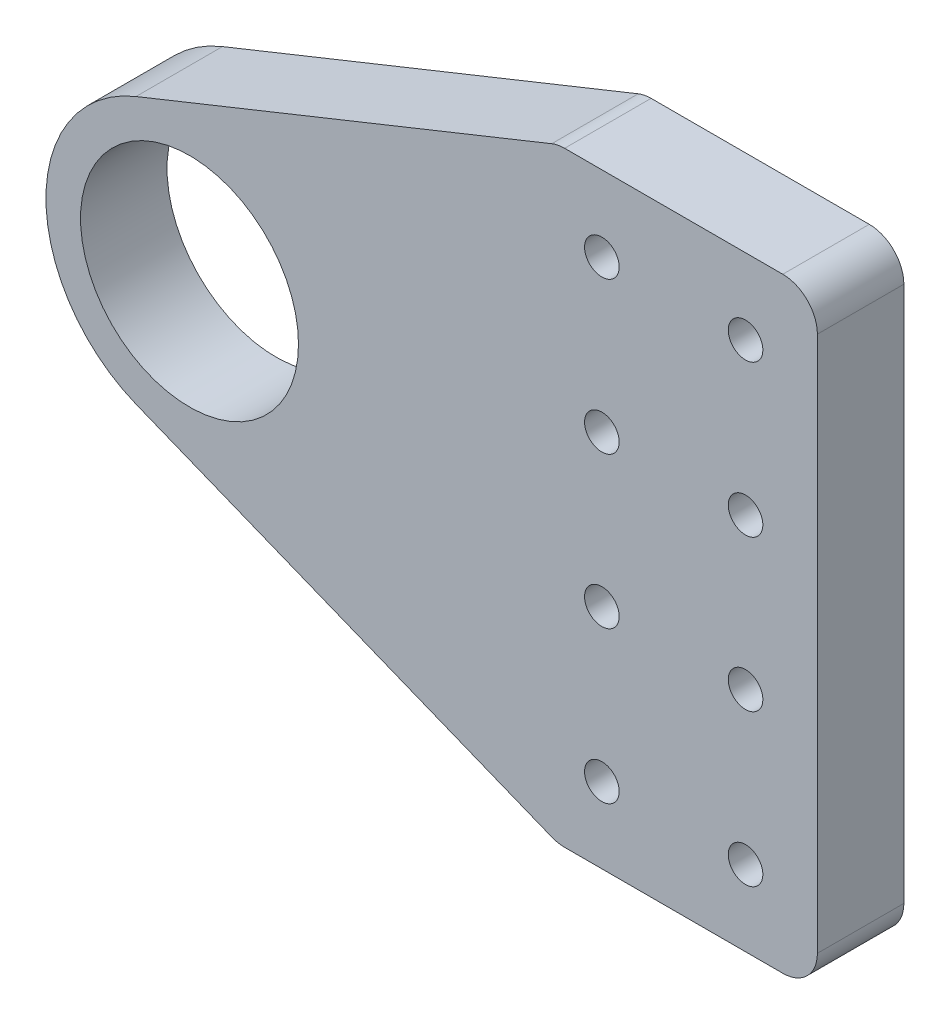
ISO-10303-21;
HEADER;
FILE_DESCRIPTION(('STEP AP214'),'2;1');
FILE_NAME('part.step','',(''),(''),'','','');
FILE_SCHEMA(('AUTOMOTIVE_DESIGN { 1 0 10303 214 1 1 1 1 }'));
ENDSEC;
DATA;
#1=APPLICATION_CONTEXT('core data for automotive mechanical design processes');
#2=APPLICATION_PROTOCOL_DEFINITION('international standard','automotive_design',2000,#1);
#3=PRODUCT_CONTEXT('',#1,'mechanical');
#4=PRODUCT('Part','Part','',(#3));
#5=PRODUCT_RELATED_PRODUCT_CATEGORY('part','',(#4));
#6=PRODUCT_DEFINITION_FORMATION('','',#4);
#7=PRODUCT_DEFINITION_CONTEXT('part definition',#1,'design');
#8=PRODUCT_DEFINITION('design','',#6,#7);
#9=PRODUCT_DEFINITION_SHAPE('','',#8);
#10=(LENGTH_UNIT() NAMED_UNIT(*) SI_UNIT(.MILLI.,.METRE.));
#11=(NAMED_UNIT(*) PLANE_ANGLE_UNIT() SI_UNIT($,.RADIAN.));
#12=(NAMED_UNIT(*) SI_UNIT($,.STERADIAN.) SOLID_ANGLE_UNIT());
#13=UNCERTAINTY_MEASURE_WITH_UNIT(LENGTH_MEASURE(1.E-05),#10,'distance_accuracy_value','');
#14=(GEOMETRIC_REPRESENTATION_CONTEXT(3) GLOBAL_UNCERTAINTY_ASSIGNED_CONTEXT((#13)) GLOBAL_UNIT_ASSIGNED_CONTEXT((#10,
#11,#12)) REPRESENTATION_CONTEXT('',''));
#15=CARTESIAN_POINT('',(0.,0.,0.));
#16=DIRECTION('',(0.,0.,1.));
#17=DIRECTION('',(1.,0.,0.));
#18=AXIS2_PLACEMENT_3D('',#15,#16,#17);
#19=CARTESIAN_POINT('',(822.198,-247.65,12.7));
#20=DIRECTION('',(0.,0.,1.));
#21=DIRECTION('',(1.,0.,0.));
#22=AXIS2_PLACEMENT_3D('',#19,#20,#21);
#23=PLANE('',#22);
#24=CARTESIAN_POINT('',(903.850524959397,-258.748026915631,12.7));
#25=DIRECTION('',(0.,0.,1.));
#26=DIRECTION('',(1.,0.,0.));
#27=AXIS2_PLACEMENT_3D('',#24,#25,#26);
#28=CIRCLE('',#27,2.53999999999996);
#29=CARTESIAN_POINT('',(906.390524959397,-258.748026915631,12.7));
#30=VERTEX_POINT('',#29);
#31=EDGE_CURVE('E248',#30,#30,#28,.T.);
#32=ORIENTED_EDGE('',*,*,#31,.F.);
#33=EDGE_LOOP('',(#32));
#34=FACE_BOUND('',#33,.T.);
#35=CARTESIAN_POINT('',(882.75157487819,-258.748026915631,12.7));
#36=DIRECTION('',(0.,0.,1.));
#37=DIRECTION('',(-1.,0.,0.));
#38=AXIS2_PLACEMENT_3D('',#35,#36,#37);
#39=CIRCLE('',#38,2.53999999999996);
#40=CARTESIAN_POINT('',(880.21157487819,-258.748026915631,12.7));
#41=VERTEX_POINT('',#40);
#42=EDGE_CURVE('E236',#41,#41,#39,.T.);
#43=ORIENTED_EDGE('',*,*,#42,.F.);
#44=EDGE_LOOP('',(#43));
#45=FACE_BOUND('',#44,.T.);
#46=CARTESIAN_POINT('',(882.75157487819,-236.551973084369,12.7));
#47=DIRECTION('',(0.,0.,1.));
#48=DIRECTION('',(1.,0.,0.));
#49=AXIS2_PLACEMENT_3D('',#46,#47,#48);
#50=CIRCLE('',#49,2.53999999999996);
#51=CARTESIAN_POINT('',(885.29157487819,-236.551973084369,12.7));
#52=VERTEX_POINT('',#51);
#53=EDGE_CURVE('E224',#52,#52,#50,.T.);
#54=ORIENTED_EDGE('',*,*,#53,.F.);
#55=EDGE_LOOP('',(#54));
#56=FACE_BOUND('',#55,.T.);
#57=CARTESIAN_POINT('',(822.198,-247.65,12.7));
#58=DIRECTION('',(0.,0.,1.));
#59=DIRECTION('',(1.,0.,0.));
#60=AXIS2_PLACEMENT_3D('',#57,#58,#59);
#61=CIRCLE('',#60,16.0019999999999);
#62=CARTESIAN_POINT('',(838.2,-247.65,12.7));
#63=VERTEX_POINT('',#62);
#64=EDGE_CURVE('E212',#63,#63,#61,.T.);
#65=ORIENTED_EDGE('',*,*,#64,.F.);
#66=EDGE_LOOP('',(#65));
#67=FACE_BOUND('',#66,.T.);
#68=CARTESIAN_POINT('',(822.198,-247.65,12.7));
#69=DIRECTION('',(0.,0.,1.));
#70=DIRECTION('',(1.,0.,0.));
#71=AXIS2_PLACEMENT_3D('',#68,#69,#70);
#72=CIRCLE('',#71,21.0820000000001);
#73=CARTESIAN_POINT('',(814.3402563121,-228.087111968442,12.7));
#74=VERTEX_POINT('',#73);
#75=CARTESIAN_POINT('',(814.3402563121,-267.212888031558,12.7));
#76=VERTEX_POINT('',#75);
#77=EDGE_CURVE('E161',#74,#76,#72,.T.);
#78=ORIENTED_EDGE('',*,*,#77,.T.);
#79=DIRECTION('',(0.927942701430507,-0.372722876762151,0.));
#80=VECTOR('',#79,1.);
#81=CARTESIAN_POINT('',(875.388667623635,-291.733948923267,12.7));
#82=LINE('',#81,#80);
#83=CARTESIAN_POINT('',(875.388667623635,-291.733948923267,12.7));
#84=VERTEX_POINT('',#83);
#85=EDGE_CURVE('E99',#76,#84,#82,.T.);
#86=ORIENTED_EDGE('',*,*,#85,.T.);
#87=CARTESIAN_POINT('',(877.282099837587,-287.02,12.7));
#88=DIRECTION('',(0.,0.,1.));
#89=DIRECTION('',(-1.,0.,0.));
#90=AXIS2_PLACEMENT_3D('',#87,#88,#89);
#91=CIRCLE('',#90,5.07999999999995);
#92=CARTESIAN_POINT('',(877.282099837587,-292.1,12.7));
#93=VERTEX_POINT('',#92);
#94=EDGE_CURVE('E182',#84,#93,#91,.T.);
#95=ORIENTED_EDGE('',*,*,#94,.T.);
#96=DIRECTION('',(1.,0.,0.));
#97=VECTOR('',#96,1.);
#98=CARTESIAN_POINT('',(877.282099837587,-292.1,12.7));
#99=LINE('',#98,#97);
#100=CARTESIAN_POINT('',(909.32,-292.1,12.7));
#101=VERTEX_POINT('',#100);
#102=EDGE_CURVE('E201',#93,#101,#99,.T.);
#103=ORIENTED_EDGE('',*,*,#102,.T.);
#104=CARTESIAN_POINT('',(909.32,-287.02,12.7));
#105=DIRECTION('',(0.,0.,1.));
#106=DIRECTION('',(1.,0.,0.));
#107=AXIS2_PLACEMENT_3D('',#104,#105,#106);
#108=CIRCLE('',#107,5.07999999999997);
#109=CARTESIAN_POINT('',(914.4,-287.02,12.7));
#110=VERTEX_POINT('',#109);
#111=EDGE_CURVE('E198',#101,#110,#108,.T.);
#112=ORIENTED_EDGE('',*,*,#111,.T.);
#113=DIRECTION('',(0.,1.,0.));
#114=VECTOR('',#113,1.);
#115=CARTESIAN_POINT('',(914.4,-287.02,12.7));
#116=LINE('',#115,#114);
#117=CARTESIAN_POINT('',(914.4,-208.28,12.7));
#118=VERTEX_POINT('',#117);
#119=EDGE_CURVE('E200',#110,#118,#116,.T.);
#120=ORIENTED_EDGE('',*,*,#119,.T.);
#121=CARTESIAN_POINT('',(909.32,-208.28,12.7));
#122=DIRECTION('',(0.,0.,1.));
#123=DIRECTION('',(-1.,0.,0.));
#124=AXIS2_PLACEMENT_3D('',#121,#122,#123);
#125=CIRCLE('',#124,5.07999999999999);
#126=CARTESIAN_POINT('',(909.32,-203.2,12.7));
#127=VERTEX_POINT('',#126);
#128=EDGE_CURVE('E124',#118,#127,#125,.T.);
#129=ORIENTED_EDGE('',*,*,#128,.T.);
#130=DIRECTION('',(-1.,0.,0.));
#131=VECTOR('',#130,1.);
#132=CARTESIAN_POINT('',(877.282099837587,-203.2,12.7));
#133=LINE('',#132,#131);
#134=CARTESIAN_POINT('',(877.282099837587,-203.2,12.7));
#135=VERTEX_POINT('',#134);
#136=EDGE_CURVE('E118',#127,#135,#133,.T.);
#137=ORIENTED_EDGE('',*,*,#136,.T.);
#138=CARTESIAN_POINT('',(877.282099837587,-208.28,12.7));
#139=DIRECTION('',(0.,0.,1.));
#140=DIRECTION('',(1.,0.,0.));
#141=AXIS2_PLACEMENT_3D('',#138,#139,#140);
#142=CIRCLE('',#141,5.08);
#143=CARTESIAN_POINT('',(875.388667623635,-203.566051076733,12.7));
#144=VERTEX_POINT('',#143);
#145=EDGE_CURVE('E122',#135,#144,#142,.T.);
#146=ORIENTED_EDGE('',*,*,#145,.T.);
#147=DIRECTION('',(-0.927942701430507,-0.372722876762151,0.));
#148=VECTOR('',#147,1.);
#149=CARTESIAN_POINT('',(875.388667623635,-203.566051076733,12.7));
#150=LINE('',#149,#148);
#151=EDGE_CURVE('E50',#144,#74,#150,.T.);
#152=ORIENTED_EDGE('',*,*,#151,.T.);
#153=EDGE_LOOP('',(#78,#86,#95,#103,#112,#120,#129,#137,#146,#152));
#154=FACE_BOUND('',#153,.T.);
#155=CARTESIAN_POINT('',(903.850524959397,-214.298026915631,12.7));
#156=DIRECTION('',(0.,0.,1.));
#157=DIRECTION('',(1.,0.,0.));
#158=AXIS2_PLACEMENT_3D('',#155,#156,#157);
#159=CIRCLE('',#158,2.53999999999996);
#160=CARTESIAN_POINT('',(906.390524959397,-214.298026915631,12.7));
#161=VERTEX_POINT('',#160);
#162=EDGE_CURVE('E146',#161,#161,#159,.T.);
#163=ORIENTED_EDGE('',*,*,#162,.F.);
#164=EDGE_LOOP('',(#163));
#165=FACE_BOUND('',#164,.T.);
#166=CARTESIAN_POINT('',(882.75157487819,-214.298026915631,12.7));
#167=DIRECTION('',(0.,0.,1.));
#168=DIRECTION('',(-1.,0.,0.));
#169=AXIS2_PLACEMENT_3D('',#166,#167,#168);
#170=CIRCLE('',#169,2.53999999999996);
#171=CARTESIAN_POINT('',(880.21157487819,-214.298026915631,12.7));
#172=VERTEX_POINT('',#171);
#173=EDGE_CURVE('E218',#172,#172,#170,.T.);
#174=ORIENTED_EDGE('',*,*,#173,.F.);
#175=EDGE_LOOP('',(#174));
#176=FACE_BOUND('',#175,.T.);
#177=CARTESIAN_POINT('',(903.850524959397,-236.551973084369,12.7));
#178=DIRECTION('',(0.,0.,1.));
#179=DIRECTION('',(-1.,0.,0.));
#180=AXIS2_PLACEMENT_3D('',#177,#178,#179);
#181=CIRCLE('',#180,2.53999999999996);
#182=CARTESIAN_POINT('',(901.310524959397,-236.551973084369,12.7));
#183=VERTEX_POINT('',#182);
#184=EDGE_CURVE('E230',#183,#183,#181,.T.);
#185=ORIENTED_EDGE('',*,*,#184,.F.);
#186=EDGE_LOOP('',(#185));
#187=FACE_BOUND('',#186,.T.);
#188=CARTESIAN_POINT('',(882.75157487819,-281.001973084369,12.7));
#189=DIRECTION('',(0.,0.,1.));
#190=DIRECTION('',(1.,0.,0.));
#191=AXIS2_PLACEMENT_3D('',#188,#189,#190);
#192=CIRCLE('',#191,2.53999999999996);
#193=CARTESIAN_POINT('',(885.29157487819,-281.001973084369,12.7));
#194=VERTEX_POINT('',#193);
#195=EDGE_CURVE('E242',#194,#194,#192,.T.);
#196=ORIENTED_EDGE('',*,*,#195,.F.);
#197=EDGE_LOOP('',(#196));
#198=FACE_BOUND('',#197,.T.);
#199=CARTESIAN_POINT('',(903.850524959397,-281.001973084369,12.7));
#200=DIRECTION('',(0.,0.,1.));
#201=DIRECTION('',(-1.,0.,0.));
#202=AXIS2_PLACEMENT_3D('',#199,#200,#201);
#203=CIRCLE('',#202,2.53999999999996);
#204=CARTESIAN_POINT('',(901.310524959397,-281.001973084369,12.7));
#205=VERTEX_POINT('',#204);
#206=EDGE_CURVE('E254',#205,#205,#203,.T.);
#207=ORIENTED_EDGE('',*,*,#206,.F.);
#208=EDGE_LOOP('',(#207));
#209=FACE_BOUND('',#208,.T.);
#210=ADVANCED_FACE('F33',(#34,#45,#56,#67,#154,#165,#176,#187,#198,#209),#23,.T.);
#211=CARTESIAN_POINT('',(822.198,-247.65,0.));
#212=DIRECTION('',(0.,0.,1.));
#213=DIRECTION('',(1.,0.,0.));
#214=AXIS2_PLACEMENT_3D('',#211,#212,#213);
#215=PLANE('',#214);
#216=CARTESIAN_POINT('',(822.198,-247.65,0.));
#217=DIRECTION('',(0.,0.,1.));
#218=DIRECTION('',(1.,0.,0.));
#219=AXIS2_PLACEMENT_3D('',#216,#217,#218);
#220=CIRCLE('',#219,21.0820000000001);
#221=CARTESIAN_POINT('',(814.3402563121,-228.087111968442,0.));
#222=VERTEX_POINT('',#221);
#223=CARTESIAN_POINT('',(814.3402563121,-267.212888031558,0.));
#224=VERTEX_POINT('',#223);
#225=EDGE_CURVE('E142',#222,#224,#220,.T.);
#226=ORIENTED_EDGE('',*,*,#225,.F.);
#227=DIRECTION('',(-0.927942701430507,-0.372722876762151,0.));
#228=VECTOR('',#227,1.);
#229=CARTESIAN_POINT('',(875.388667623635,-203.566051076733,0.));
#230=LINE('',#229,#228);
#231=CARTESIAN_POINT('',(875.388667623635,-203.566051076733,0.));
#232=VERTEX_POINT('',#231);
#233=EDGE_CURVE('E91',#232,#222,#230,.T.);
#234=ORIENTED_EDGE('',*,*,#233,.F.);
#235=CARTESIAN_POINT('',(877.282099837587,-208.28,0.));
#236=DIRECTION('',(0.,0.,1.));
#237=DIRECTION('',(1.,0.,0.));
#238=AXIS2_PLACEMENT_3D('',#235,#236,#237);
#239=CIRCLE('',#238,5.08);
#240=CARTESIAN_POINT('',(877.282099837587,-203.2,0.));
#241=VERTEX_POINT('',#240);
#242=EDGE_CURVE('E85',#241,#232,#239,.T.);
#243=ORIENTED_EDGE('',*,*,#242,.F.);
#244=DIRECTION('',(-1.,0.,0.));
#245=VECTOR('',#244,1.);
#246=CARTESIAN_POINT('',(877.282099837587,-203.2,0.));
#247=LINE('',#246,#245);
#248=CARTESIAN_POINT('',(909.32,-203.2,0.));
#249=VERTEX_POINT('',#248);
#250=EDGE_CURVE('E132',#249,#241,#247,.T.);
#251=ORIENTED_EDGE('',*,*,#250,.F.);
#252=CARTESIAN_POINT('',(909.32,-208.28,0.));
#253=DIRECTION('',(0.,0.,1.));
#254=DIRECTION('',(-1.,0.,0.));
#255=AXIS2_PLACEMENT_3D('',#252,#253,#254);
#256=CIRCLE('',#255,5.07999999999999);
#257=CARTESIAN_POINT('',(914.4,-208.28,0.));
#258=VERTEX_POINT('',#257);
#259=EDGE_CURVE('E156',#258,#249,#256,.T.);
#260=ORIENTED_EDGE('',*,*,#259,.F.);
#261=DIRECTION('',(0.,1.,0.));
#262=VECTOR('',#261,1.);
#263=CARTESIAN_POINT('',(914.4,-287.02,0.));
#264=LINE('',#263,#262);
#265=CARTESIAN_POINT('',(914.4,-287.02,0.));
#266=VERTEX_POINT('',#265);
#267=EDGE_CURVE('E154',#266,#258,#264,.T.);
#268=ORIENTED_EDGE('',*,*,#267,.F.);
#269=CARTESIAN_POINT('',(909.32,-287.02,0.));
#270=DIRECTION('',(0.,0.,1.));
#271=DIRECTION('',(1.,0.,0.));
#272=AXIS2_PLACEMENT_3D('',#269,#270,#271);
#273=CIRCLE('',#272,5.07999999999997);
#274=CARTESIAN_POINT('',(909.32,-292.1,0.));
#275=VERTEX_POINT('',#274);
#276=EDGE_CURVE('E152',#275,#266,#273,.T.);
#277=ORIENTED_EDGE('',*,*,#276,.F.);
#278=DIRECTION('',(1.,0.,0.));
#279=VECTOR('',#278,1.);
#280=CARTESIAN_POINT('',(877.282099837587,-292.1,0.));
#281=LINE('',#280,#279);
#282=CARTESIAN_POINT('',(877.282099837587,-292.1,0.));
#283=VERTEX_POINT('',#282);
#284=EDGE_CURVE('E150',#283,#275,#281,.T.);
#285=ORIENTED_EDGE('',*,*,#284,.F.);
#286=CARTESIAN_POINT('',(877.282099837587,-287.02,0.));
#287=DIRECTION('',(0.,0.,1.));
#288=DIRECTION('',(-1.,0.,0.));
#289=AXIS2_PLACEMENT_3D('',#286,#287,#288);
#290=CIRCLE('',#289,5.07999999999995);
#291=CARTESIAN_POINT('',(875.388667623635,-291.733948923267,0.));
#292=VERTEX_POINT('',#291);
#293=EDGE_CURVE('E148',#292,#283,#290,.T.);
#294=ORIENTED_EDGE('',*,*,#293,.F.);
#295=DIRECTION('',(0.927942701430507,-0.372722876762151,0.));
#296=VECTOR('',#295,1.);
#297=CARTESIAN_POINT('',(875.388667623635,-291.733948923267,0.));
#298=LINE('',#297,#296);
#299=EDGE_CURVE('E145',#224,#292,#298,.T.);
#300=ORIENTED_EDGE('',*,*,#299,.F.);
#301=EDGE_LOOP('',(#226,#234,#243,#251,#260,#268,#277,#285,#294,#300));
#302=FACE_BOUND('',#301,.T.);
#303=CARTESIAN_POINT('',(903.850524959397,-214.298026915631,0.));
#304=DIRECTION('',(0.,0.,1.));
#305=DIRECTION('',(1.,0.,0.));
#306=AXIS2_PLACEMENT_3D('',#303,#304,#305);
#307=CIRCLE('',#306,2.53999999999996);
#308=CARTESIAN_POINT('',(906.390524959397,-214.298026915631,0.));
#309=VERTEX_POINT('',#308);
#310=EDGE_CURVE('E209',#309,#309,#307,.T.);
#311=ORIENTED_EDGE('',*,*,#310,.T.);
#312=EDGE_LOOP('',(#311));
#313=FACE_BOUND('',#312,.T.);
#314=CARTESIAN_POINT('',(822.198,-247.65,0.));
#315=DIRECTION('',(0.,0.,1.));
#316=DIRECTION('',(1.,0.,0.));
#317=AXIS2_PLACEMENT_3D('',#314,#315,#316);
#318=CIRCLE('',#317,16.0019999999999);
#319=CARTESIAN_POINT('',(838.2,-247.65,0.));
#320=VERTEX_POINT('',#319);
#321=EDGE_CURVE('E215',#320,#320,#318,.T.);
#322=ORIENTED_EDGE('',*,*,#321,.T.);
#323=EDGE_LOOP('',(#322));
#324=FACE_BOUND('',#323,.T.);
#325=CARTESIAN_POINT('',(882.75157487819,-214.298026915631,0.));
#326=DIRECTION('',(0.,0.,1.));
#327=DIRECTION('',(-1.,0.,0.));
#328=AXIS2_PLACEMENT_3D('',#325,#326,#327);
#329=CIRCLE('',#328,2.53999999999996);
#330=CARTESIAN_POINT('',(880.21157487819,-214.298026915631,0.));
#331=VERTEX_POINT('',#330);
#332=EDGE_CURVE('E221',#331,#331,#329,.T.);
#333=ORIENTED_EDGE('',*,*,#332,.T.);
#334=EDGE_LOOP('',(#333));
#335=FACE_BOUND('',#334,.T.);
#336=CARTESIAN_POINT('',(882.75157487819,-236.551973084369,0.));
#337=DIRECTION('',(0.,0.,1.));
#338=DIRECTION('',(1.,0.,0.));
#339=AXIS2_PLACEMENT_3D('',#336,#337,#338);
#340=CIRCLE('',#339,2.53999999999996);
#341=CARTESIAN_POINT('',(885.29157487819,-236.551973084369,0.));
#342=VERTEX_POINT('',#341);
#343=EDGE_CURVE('E227',#342,#342,#340,.T.);
#344=ORIENTED_EDGE('',*,*,#343,.T.);
#345=EDGE_LOOP('',(#344));
#346=FACE_BOUND('',#345,.T.);
#347=CARTESIAN_POINT('',(903.850524959397,-236.551973084369,0.));
#348=DIRECTION('',(0.,0.,1.));
#349=DIRECTION('',(-1.,0.,0.));
#350=AXIS2_PLACEMENT_3D('',#347,#348,#349);
#351=CIRCLE('',#350,2.53999999999996);
#352=CARTESIAN_POINT('',(901.310524959397,-236.551973084369,0.));
#353=VERTEX_POINT('',#352);
#354=EDGE_CURVE('E233',#353,#353,#351,.T.);
#355=ORIENTED_EDGE('',*,*,#354,.T.);
#356=EDGE_LOOP('',(#355));
#357=FACE_BOUND('',#356,.T.);
#358=CARTESIAN_POINT('',(882.75157487819,-258.748026915631,0.));
#359=DIRECTION('',(0.,0.,1.));
#360=DIRECTION('',(-1.,0.,0.));
#361=AXIS2_PLACEMENT_3D('',#358,#359,#360);
#362=CIRCLE('',#361,2.53999999999996);
#363=CARTESIAN_POINT('',(880.21157487819,-258.748026915631,0.));
#364=VERTEX_POINT('',#363);
#365=EDGE_CURVE('E239',#364,#364,#362,.T.);
#366=ORIENTED_EDGE('',*,*,#365,.T.);
#367=EDGE_LOOP('',(#366));
#368=FACE_BOUND('',#367,.T.);
#369=CARTESIAN_POINT('',(882.75157487819,-281.001973084369,0.));
#370=DIRECTION('',(0.,0.,1.));
#371=DIRECTION('',(1.,0.,0.));
#372=AXIS2_PLACEMENT_3D('',#369,#370,#371);
#373=CIRCLE('',#372,2.53999999999996);
#374=CARTESIAN_POINT('',(885.29157487819,-281.001973084369,0.));
#375=VERTEX_POINT('',#374);
#376=EDGE_CURVE('E245',#375,#375,#373,.T.);
#377=ORIENTED_EDGE('',*,*,#376,.T.);
#378=EDGE_LOOP('',(#377));
#379=FACE_BOUND('',#378,.T.);
#380=CARTESIAN_POINT('',(903.850524959397,-258.748026915631,0.));
#381=DIRECTION('',(0.,0.,1.));
#382=DIRECTION('',(1.,0.,0.));
#383=AXIS2_PLACEMENT_3D('',#380,#381,#382);
#384=CIRCLE('',#383,2.53999999999996);
#385=CARTESIAN_POINT('',(906.390524959397,-258.748026915631,0.));
#386=VERTEX_POINT('',#385);
#387=EDGE_CURVE('E251',#386,#386,#384,.T.);
#388=ORIENTED_EDGE('',*,*,#387,.T.);
#389=EDGE_LOOP('',(#388));
#390=FACE_BOUND('',#389,.T.);
#391=CARTESIAN_POINT('',(903.850524959397,-281.001973084369,0.));
#392=DIRECTION('',(0.,0.,1.));
#393=DIRECTION('',(-1.,0.,0.));
#394=AXIS2_PLACEMENT_3D('',#391,#392,#393);
#395=CIRCLE('',#394,2.53999999999996);
#396=CARTESIAN_POINT('',(901.310524959397,-281.001973084369,0.));
#397=VERTEX_POINT('',#396);
#398=EDGE_CURVE('E257',#397,#397,#395,.T.);
#399=ORIENTED_EDGE('',*,*,#398,.T.);
#400=EDGE_LOOP('',(#399));
#401=FACE_BOUND('',#400,.T.);
#402=ADVANCED_FACE('F186',(#302,#313,#324,#335,#346,#357,#368,#379,#390,#401),#215,.F.);
#403=CARTESIAN_POINT('',(822.198,-247.65,12.7));
#404=DIRECTION('',(0.,0.,-1.));
#405=DIRECTION('',(-1.,0.,0.));
#406=AXIS2_PLACEMENT_3D('',#403,#404,#405);
#407=CYLINDRICAL_SURFACE('',#406,21.0820000000001);
#408=ORIENTED_EDGE('',*,*,#225,.T.);
#409=DIRECTION('',(0.,0.,-1.));
#410=VECTOR('',#409,1.);
#411=CARTESIAN_POINT('',(814.3402563121,-267.212888031558,12.7));
#412=LINE('',#411,#410);
#413=EDGE_CURVE('E11',#76,#224,#412,.T.);
#414=ORIENTED_EDGE('',*,*,#413,.F.);
#415=ORIENTED_EDGE('',*,*,#77,.F.);
#416=DIRECTION('',(0.,0.,-1.));
#417=VECTOR('',#416,1.);
#418=CARTESIAN_POINT('',(814.3402563121,-228.087111968442,12.7));
#419=LINE('',#418,#417);
#420=EDGE_CURVE('E138',#74,#222,#419,.T.);
#421=ORIENTED_EDGE('',*,*,#420,.T.);
#422=EDGE_LOOP('',(#408,#414,#415,#421));
#423=FACE_BOUND('',#422,.T.);
#424=ADVANCED_FACE('F35',(#423),#407,.T.);
#425=CARTESIAN_POINT('',(875.388667623635,-291.733948923267,12.7));
#426=DIRECTION('',(0.372722876762151,0.927942701430507,0.));
#427=DIRECTION('',(-0.927942701430507,0.372722876762151,0.));
#428=AXIS2_PLACEMENT_3D('',#425,#426,#427);
#429=PLANE('',#428);
#430=ORIENTED_EDGE('',*,*,#299,.T.);
#431=DIRECTION('',(0.,0.,-1.));
#432=VECTOR('',#431,1.);
#433=CARTESIAN_POINT('',(875.388667623635,-291.733948923267,12.7));
#434=LINE('',#433,#432);
#435=EDGE_CURVE('E42',#84,#292,#434,.T.);
#436=ORIENTED_EDGE('',*,*,#435,.F.);
#437=ORIENTED_EDGE('',*,*,#85,.F.);
#438=ORIENTED_EDGE('',*,*,#413,.T.);
#439=EDGE_LOOP('',(#430,#436,#437,#438));
#440=FACE_BOUND('',#439,.T.);
#441=ADVANCED_FACE('F299',(#440),#429,.F.);
#442=CARTESIAN_POINT('',(877.282099837587,-287.02,12.7));
#443=DIRECTION('',(0.,0.,-1.));
#444=DIRECTION('',(-1.,0.,0.));
#445=AXIS2_PLACEMENT_3D('',#442,#443,#444);
#446=CYLINDRICAL_SURFACE('',#445,5.07999999999995);
#447=ORIENTED_EDGE('',*,*,#293,.T.);
#448=DIRECTION('',(0.,0.,-1.));
#449=VECTOR('',#448,1.);
#450=CARTESIAN_POINT('',(877.282099837587,-292.1,12.7));
#451=LINE('',#450,#449);
#452=EDGE_CURVE('E174',#93,#283,#451,.T.);
#453=ORIENTED_EDGE('',*,*,#452,.F.);
#454=ORIENTED_EDGE('',*,*,#94,.F.);
#455=ORIENTED_EDGE('',*,*,#435,.T.);
#456=EDGE_LOOP('',(#447,#453,#454,#455));
#457=FACE_BOUND('',#456,.T.);
#458=ADVANCED_FACE('F180',(#457),#446,.T.);
#459=CARTESIAN_POINT('',(877.282099837587,-292.1,12.7));
#460=DIRECTION('',(0.,1.,0.));
#461=DIRECTION('',(0.,0.,1.));
#462=AXIS2_PLACEMENT_3D('',#459,#460,#461);
#463=PLANE('',#462);
#464=ORIENTED_EDGE('',*,*,#284,.T.);
#465=DIRECTION('',(0.,0.,-1.));
#466=VECTOR('',#465,1.);
#467=CARTESIAN_POINT('',(909.32,-292.1,12.7));
#468=LINE('',#467,#466);
#469=EDGE_CURVE('E171',#101,#275,#468,.T.);
#470=ORIENTED_EDGE('',*,*,#469,.F.);
#471=ORIENTED_EDGE('',*,*,#102,.F.);
#472=ORIENTED_EDGE('',*,*,#452,.T.);
#473=EDGE_LOOP('',(#464,#470,#471,#472));
#474=FACE_BOUND('',#473,.T.);
#475=ADVANCED_FACE('F192',(#474),#463,.F.);
#476=CARTESIAN_POINT('',(909.32,-287.02,12.7));
#477=DIRECTION('',(0.,0.,-1.));
#478=DIRECTION('',(-1.,0.,0.));
#479=AXIS2_PLACEMENT_3D('',#476,#477,#478);
#480=CYLINDRICAL_SURFACE('',#479,5.07999999999997);
#481=ORIENTED_EDGE('',*,*,#276,.T.);
#482=DIRECTION('',(0.,0.,-1.));
#483=VECTOR('',#482,1.);
#484=CARTESIAN_POINT('',(914.4,-287.02,12.7));
#485=LINE('',#484,#483);
#486=EDGE_CURVE('E168',#110,#266,#485,.T.);
#487=ORIENTED_EDGE('',*,*,#486,.F.);
#488=ORIENTED_EDGE('',*,*,#111,.F.);
#489=ORIENTED_EDGE('',*,*,#469,.T.);
#490=EDGE_LOOP('',(#481,#487,#488,#489));
#491=FACE_BOUND('',#490,.T.);
#492=ADVANCED_FACE('F196',(#491),#480,.T.);
#493=CARTESIAN_POINT('',(914.4,-287.02,12.7));
#494=DIRECTION('',(-1.,0.,0.));
#495=DIRECTION('',(0.,0.,1.));
#496=AXIS2_PLACEMENT_3D('',#493,#494,#495);
#497=PLANE('',#496);
#498=ORIENTED_EDGE('',*,*,#267,.T.);
#499=DIRECTION('',(0.,0.,-1.));
#500=VECTOR('',#499,1.);
#501=CARTESIAN_POINT('',(914.4,-208.28,12.7));
#502=LINE('',#501,#500);
#503=EDGE_CURVE('E165',#118,#258,#502,.T.);
#504=ORIENTED_EDGE('',*,*,#503,.F.);
#505=ORIENTED_EDGE('',*,*,#119,.F.);
#506=ORIENTED_EDGE('',*,*,#486,.T.);
#507=EDGE_LOOP('',(#498,#504,#505,#506));
#508=FACE_BOUND('',#507,.T.);
#509=ADVANCED_FACE('F289',(#508),#497,.F.);
#510=CARTESIAN_POINT('',(909.32,-208.28,12.7));
#511=DIRECTION('',(0.,0.,-1.));
#512=DIRECTION('',(-1.,0.,0.));
#513=AXIS2_PLACEMENT_3D('',#510,#511,#512);
#514=CYLINDRICAL_SURFACE('',#513,5.07999999999999);
#515=ORIENTED_EDGE('',*,*,#259,.T.);
#516=DIRECTION('',(0.,0.,-1.));
#517=VECTOR('',#516,1.);
#518=CARTESIAN_POINT('',(909.32,-203.2,12.7));
#519=LINE('',#518,#517);
#520=EDGE_CURVE('E133',#127,#249,#519,.T.);
#521=ORIENTED_EDGE('',*,*,#520,.F.);
#522=ORIENTED_EDGE('',*,*,#128,.F.);
#523=ORIENTED_EDGE('',*,*,#503,.T.);
#524=EDGE_LOOP('',(#515,#521,#522,#523));
#525=FACE_BOUND('',#524,.T.);
#526=ADVANCED_FACE('F286',(#525),#514,.T.);
#527=CARTESIAN_POINT('',(877.282099837587,-203.2,12.7));
#528=DIRECTION('',(0.,-1.,0.));
#529=DIRECTION('',(1.,0.,0.));
#530=AXIS2_PLACEMENT_3D('',#527,#528,#529);
#531=PLANE('',#530);
#532=ORIENTED_EDGE('',*,*,#250,.T.);
#533=DIRECTION('',(0.,0.,-1.));
#534=VECTOR('',#533,1.);
#535=CARTESIAN_POINT('',(877.282099837587,-203.2,12.7));
#536=LINE('',#535,#534);
#537=EDGE_CURVE('E129',#135,#241,#536,.T.);
#538=ORIENTED_EDGE('',*,*,#537,.F.);
#539=ORIENTED_EDGE('',*,*,#136,.F.);
#540=ORIENTED_EDGE('',*,*,#520,.T.);
#541=EDGE_LOOP('',(#532,#538,#539,#540));
#542=FACE_BOUND('',#541,.T.);
#543=ADVANCED_FACE('F130',(#542),#531,.F.);
#544=CARTESIAN_POINT('',(877.282099837587,-208.28,12.7));
#545=DIRECTION('',(0.,0.,-1.));
#546=DIRECTION('',(-1.,0.,0.));
#547=AXIS2_PLACEMENT_3D('',#544,#545,#546);
#548=CYLINDRICAL_SURFACE('',#547,5.08);
#549=ORIENTED_EDGE('',*,*,#242,.T.);
#550=DIRECTION('',(0.,0.,-1.));
#551=VECTOR('',#550,1.);
#552=CARTESIAN_POINT('',(875.388667623635,-203.566051076733,12.7));
#553=LINE('',#552,#551);
#554=EDGE_CURVE('E134',#144,#232,#553,.T.);
#555=ORIENTED_EDGE('',*,*,#554,.F.);
#556=ORIENTED_EDGE('',*,*,#145,.F.);
#557=ORIENTED_EDGE('',*,*,#537,.T.);
#558=EDGE_LOOP('',(#549,#555,#556,#557));
#559=FACE_BOUND('',#558,.T.);
#560=ADVANCED_FACE('F136',(#559),#548,.T.);
#561=CARTESIAN_POINT('',(875.388667623635,-203.566051076733,12.7));
#562=DIRECTION('',(0.372722876762151,-0.927942701430507,0.));
#563=DIRECTION('',(0.927942701430507,0.372722876762151,0.));
#564=AXIS2_PLACEMENT_3D('',#561,#562,#563);
#565=PLANE('',#564);
#566=ORIENTED_EDGE('',*,*,#233,.T.);
#567=ORIENTED_EDGE('',*,*,#420,.F.);
#568=ORIENTED_EDGE('',*,*,#151,.F.);
#569=ORIENTED_EDGE('',*,*,#554,.T.);
#570=EDGE_LOOP('',(#566,#567,#568,#569));
#571=FACE_BOUND('',#570,.T.);
#572=ADVANCED_FACE('F279',(#571),#565,.F.);
#573=CARTESIAN_POINT('',(903.850524959397,-214.298026915631,12.7));
#574=DIRECTION('',(0.,0.,-1.));
#575=DIRECTION('',(-1.,0.,0.));
#576=AXIS2_PLACEMENT_3D('',#573,#574,#575);
#577=CYLINDRICAL_SURFACE('',#576,2.53999999999996);
#578=ORIENTED_EDGE('',*,*,#162,.T.);
#579=EDGE_LOOP('',(#578));
#580=FACE_BOUND('',#579,.T.);
#581=ORIENTED_EDGE('',*,*,#310,.F.);
#582=EDGE_LOOP('',(#581));
#583=FACE_BOUND('',#582,.T.);
#584=ADVANCED_FACE('F276',(#580,#583),#577,.F.);
#585=CARTESIAN_POINT('',(822.198,-247.65,12.7));
#586=DIRECTION('',(0.,0.,-1.));
#587=DIRECTION('',(-1.,0.,0.));
#588=AXIS2_PLACEMENT_3D('',#585,#586,#587);
#589=CYLINDRICAL_SURFACE('',#588,16.0019999999999);
#590=ORIENTED_EDGE('',*,*,#64,.T.);
#591=EDGE_LOOP('',(#590));
#592=FACE_BOUND('',#591,.T.);
#593=ORIENTED_EDGE('',*,*,#321,.F.);
#594=EDGE_LOOP('',(#593));
#595=FACE_BOUND('',#594,.T.);
#596=ADVANCED_FACE('F375',(#592,#595),#589,.F.);
#597=CARTESIAN_POINT('',(882.75157487819,-214.298026915631,12.7));
#598=DIRECTION('',(0.,0.,-1.));
#599=DIRECTION('',(-1.,0.,0.));
#600=AXIS2_PLACEMENT_3D('',#597,#598,#599);
#601=CYLINDRICAL_SURFACE('',#600,2.53999999999996);
#602=ORIENTED_EDGE('',*,*,#173,.T.);
#603=EDGE_LOOP('',(#602));
#604=FACE_BOUND('',#603,.T.);
#605=ORIENTED_EDGE('',*,*,#332,.F.);
#606=EDGE_LOOP('',(#605));
#607=FACE_BOUND('',#606,.T.);
#608=ADVANCED_FACE('F383',(#604,#607),#601,.F.);
#609=CARTESIAN_POINT('',(882.75157487819,-236.551973084369,12.7));
#610=DIRECTION('',(0.,0.,-1.));
#611=DIRECTION('',(-1.,0.,0.));
#612=AXIS2_PLACEMENT_3D('',#609,#610,#611);
#613=CYLINDRICAL_SURFACE('',#612,2.53999999999996);
#614=ORIENTED_EDGE('',*,*,#53,.T.);
#615=EDGE_LOOP('',(#614));
#616=FACE_BOUND('',#615,.T.);
#617=ORIENTED_EDGE('',*,*,#343,.F.);
#618=EDGE_LOOP('',(#617));
#619=FACE_BOUND('',#618,.T.);
#620=ADVANCED_FACE('F391',(#616,#619),#613,.F.);
#621=CARTESIAN_POINT('',(903.850524959397,-236.551973084369,12.7));
#622=DIRECTION('',(0.,0.,-1.));
#623=DIRECTION('',(-1.,0.,0.));
#624=AXIS2_PLACEMENT_3D('',#621,#622,#623);
#625=CYLINDRICAL_SURFACE('',#624,2.53999999999996);
#626=ORIENTED_EDGE('',*,*,#184,.T.);
#627=EDGE_LOOP('',(#626));
#628=FACE_BOUND('',#627,.T.);
#629=ORIENTED_EDGE('',*,*,#354,.F.);
#630=EDGE_LOOP('',(#629));
#631=FACE_BOUND('',#630,.T.);
#632=ADVANCED_FACE('F400',(#628,#631),#625,.F.);
#633=CARTESIAN_POINT('',(882.75157487819,-258.748026915631,12.7));
#634=DIRECTION('',(0.,0.,-1.));
#635=DIRECTION('',(-1.,0.,0.));
#636=AXIS2_PLACEMENT_3D('',#633,#634,#635);
#637=CYLINDRICAL_SURFACE('',#636,2.53999999999996);
#638=ORIENTED_EDGE('',*,*,#42,.T.);
#639=EDGE_LOOP('',(#638));
#640=FACE_BOUND('',#639,.T.);
#641=ORIENTED_EDGE('',*,*,#365,.F.);
#642=EDGE_LOOP('',(#641));
#643=FACE_BOUND('',#642,.T.);
#644=ADVANCED_FACE('F409',(#640,#643),#637,.F.);
#645=CARTESIAN_POINT('',(882.75157487819,-281.001973084369,12.7));
#646=DIRECTION('',(0.,0.,-1.));
#647=DIRECTION('',(-1.,0.,0.));
#648=AXIS2_PLACEMENT_3D('',#645,#646,#647);
#649=CYLINDRICAL_SURFACE('',#648,2.53999999999996);
#650=ORIENTED_EDGE('',*,*,#195,.T.);
#651=EDGE_LOOP('',(#650));
#652=FACE_BOUND('',#651,.T.);
#653=ORIENTED_EDGE('',*,*,#376,.F.);
#654=EDGE_LOOP('',(#653));
#655=FACE_BOUND('',#654,.T.);
#656=ADVANCED_FACE('F418',(#652,#655),#649,.F.);
#657=CARTESIAN_POINT('',(903.850524959397,-258.748026915631,12.7));
#658=DIRECTION('',(0.,0.,-1.));
#659=DIRECTION('',(-1.,0.,0.));
#660=AXIS2_PLACEMENT_3D('',#657,#658,#659);
#661=CYLINDRICAL_SURFACE('',#660,2.53999999999996);
#662=ORIENTED_EDGE('',*,*,#31,.T.);
#663=EDGE_LOOP('',(#662));
#664=FACE_BOUND('',#663,.T.);
#665=ORIENTED_EDGE('',*,*,#387,.F.);
#666=EDGE_LOOP('',(#665));
#667=FACE_BOUND('',#666,.T.);
#668=ADVANCED_FACE('F427',(#664,#667),#661,.F.);
#669=CARTESIAN_POINT('',(903.850524959397,-281.001973084369,12.7));
#670=DIRECTION('',(0.,0.,-1.));
#671=DIRECTION('',(-1.,0.,0.));
#672=AXIS2_PLACEMENT_3D('',#669,#670,#671);
#673=CYLINDRICAL_SURFACE('',#672,2.53999999999996);
#674=ORIENTED_EDGE('',*,*,#206,.T.);
#675=EDGE_LOOP('',(#674));
#676=FACE_BOUND('',#675,.T.);
#677=ORIENTED_EDGE('',*,*,#398,.F.);
#678=EDGE_LOOP('',(#677));
#679=FACE_BOUND('',#678,.T.);
#680=ADVANCED_FACE('F263',(#676,#679),#673,.F.);
#681=CLOSED_SHELL('',(#210,#402,#424,#441,#458,#475,#492,#509,#526,#543,#560,#572,#584,#596,
#608,#620,#632,#644,#656,#668,#680));
#682=MANIFOLD_SOLID_BREP('B2',#681);
#683=ADVANCED_BREP_SHAPE_REPRESENTATION('',(#18,#682),#14);
#684=SHAPE_DEFINITION_REPRESENTATION(#9,#683);
ENDSEC;
END-ISO-10303-21;
